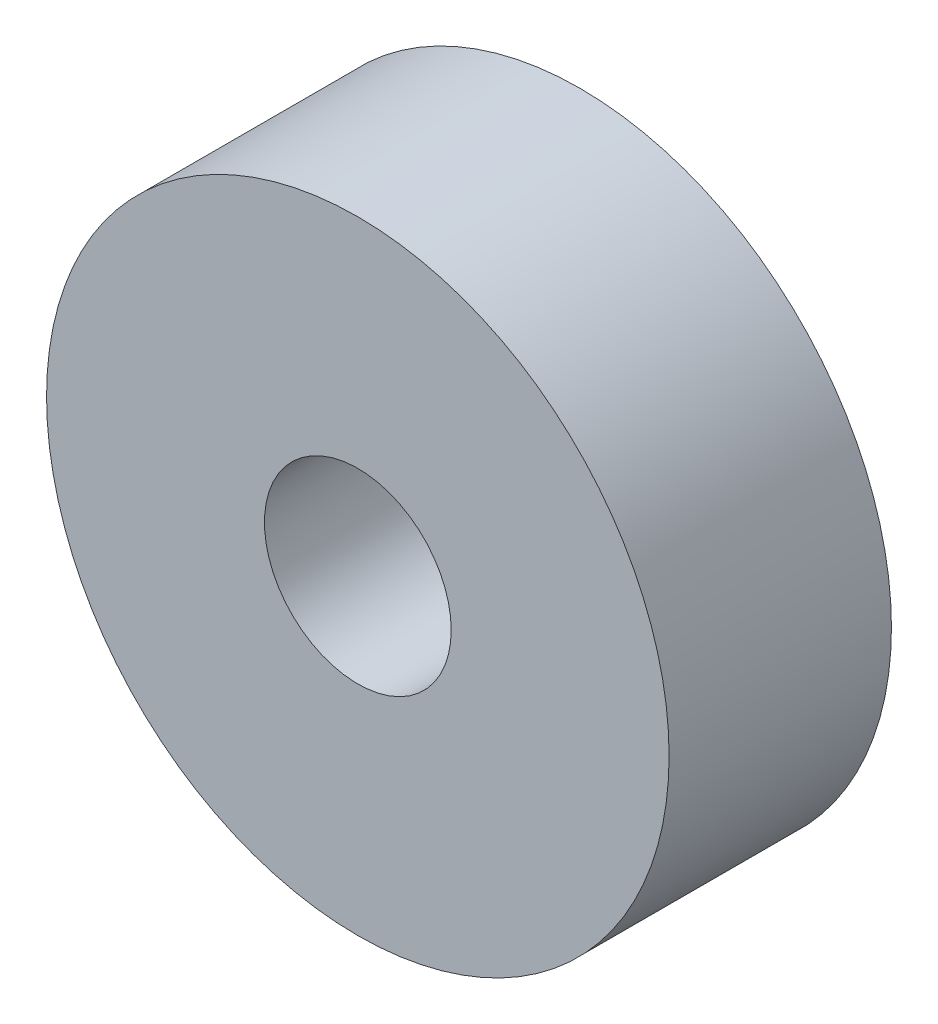
ISO-10303-21;
HEADER;
FILE_DESCRIPTION(('STEP AP214'),'2;1');
FILE_NAME('part.step','',(''),(''),'','','');
FILE_SCHEMA(('AUTOMOTIVE_DESIGN { 1 0 10303 214 1 1 1 1 }'));
ENDSEC;
DATA;
#1=APPLICATION_CONTEXT('core data for automotive mechanical design processes');
#2=APPLICATION_PROTOCOL_DEFINITION('international standard','automotive_design',2000,#1);
#3=PRODUCT_CONTEXT('',#1,'mechanical');
#4=PRODUCT('Part','Part','',(#3));
#5=PRODUCT_RELATED_PRODUCT_CATEGORY('part','',(#4));
#6=PRODUCT_DEFINITION_FORMATION('','',#4);
#7=PRODUCT_DEFINITION_CONTEXT('part definition',#1,'design');
#8=PRODUCT_DEFINITION('design','',#6,#7);
#9=PRODUCT_DEFINITION_SHAPE('','',#8);
#10=(LENGTH_UNIT() NAMED_UNIT(*) SI_UNIT(.MILLI.,.METRE.));
#11=(NAMED_UNIT(*) PLANE_ANGLE_UNIT() SI_UNIT($,.RADIAN.));
#12=(NAMED_UNIT(*) SI_UNIT($,.STERADIAN.) SOLID_ANGLE_UNIT());
#13=UNCERTAINTY_MEASURE_WITH_UNIT(LENGTH_MEASURE(1.E-05),#10,'distance_accuracy_value','');
#14=(GEOMETRIC_REPRESENTATION_CONTEXT(3) GLOBAL_UNCERTAINTY_ASSIGNED_CONTEXT((#13)) GLOBAL_UNIT_ASSIGNED_CONTEXT((#10,
#11,#12)) REPRESENTATION_CONTEXT('',''));
#15=CARTESIAN_POINT('',(0.,0.,0.));
#16=DIRECTION('',(0.,0.,1.));
#17=DIRECTION('',(1.,0.,0.));
#18=AXIS2_PLACEMENT_3D('',#15,#16,#17);
#19=CARTESIAN_POINT('',(0.,0.,5.));
#20=DIRECTION('',(0.,0.,1.));
#21=DIRECTION('',(1.,0.,0.));
#22=AXIS2_PLACEMENT_3D('',#19,#20,#21);
#23=PLANE('',#22);
#24=CARTESIAN_POINT('',(0.,0.,5.));
#25=DIRECTION('',(0.,0.,1.));
#26=DIRECTION('',(1.,0.,0.));
#27=AXIS2_PLACEMENT_3D('',#24,#25,#26);
#28=CIRCLE('',#27,7.);
#29=CARTESIAN_POINT('',(7.,0.,5.));
#30=VERTEX_POINT('',#29);
#31=EDGE_CURVE('E10',#30,#30,#28,.T.);
#32=ORIENTED_EDGE('',*,*,#31,.T.);
#33=EDGE_LOOP('',(#32));
#34=FACE_BOUND('',#33,.T.);
#35=CARTESIAN_POINT('',(0.,0.,5.));
#36=DIRECTION('',(0.,0.,1.));
#37=DIRECTION('',(1.,0.,0.));
#38=AXIS2_PLACEMENT_3D('',#35,#36,#37);
#39=CIRCLE('',#38,2.1);
#40=CARTESIAN_POINT('',(2.1,0.,5.));
#41=VERTEX_POINT('',#40);
#42=EDGE_CURVE('E56',#41,#41,#39,.T.);
#43=ORIENTED_EDGE('',*,*,#42,.F.);
#44=EDGE_LOOP('',(#43));
#45=FACE_BOUND('',#44,.T.);
#46=ADVANCED_FACE('F43',(#34,#45),#23,.T.);
#47=CARTESIAN_POINT('',(0.,0.,0.));
#48=DIRECTION('',(0.,0.,1.));
#49=DIRECTION('',(1.,0.,0.));
#50=AXIS2_PLACEMENT_3D('',#47,#48,#49);
#51=PLANE('',#50);
#52=CARTESIAN_POINT('',(0.,0.,0.));
#53=DIRECTION('',(0.,0.,1.));
#54=DIRECTION('',(1.,0.,0.));
#55=AXIS2_PLACEMENT_3D('',#52,#53,#54);
#56=CIRCLE('',#55,7.);
#57=CARTESIAN_POINT('',(7.,0.,0.));
#58=VERTEX_POINT('',#57);
#59=EDGE_CURVE('E47',#58,#58,#56,.T.);
#60=ORIENTED_EDGE('',*,*,#59,.F.);
#61=EDGE_LOOP('',(#60));
#62=FACE_BOUND('',#61,.T.);
#63=CARTESIAN_POINT('',(0.,0.,0.));
#64=DIRECTION('',(0.,0.,1.));
#65=DIRECTION('',(1.,0.,0.));
#66=AXIS2_PLACEMENT_3D('',#63,#64,#65);
#67=CIRCLE('',#66,2.1);
#68=CARTESIAN_POINT('',(2.1,0.,0.));
#69=VERTEX_POINT('',#68);
#70=EDGE_CURVE('E58',#69,#69,#67,.T.);
#71=ORIENTED_EDGE('',*,*,#70,.T.);
#72=EDGE_LOOP('',(#71));
#73=FACE_BOUND('',#72,.T.);
#74=ADVANCED_FACE('F70',(#62,#73),#51,.F.);
#75=CARTESIAN_POINT('',(0.,0.,5.));
#76=DIRECTION('',(0.,0.,-1.));
#77=DIRECTION('',(-1.,0.,0.));
#78=AXIS2_PLACEMENT_3D('',#75,#76,#77);
#79=CYLINDRICAL_SURFACE('',#78,7.);
#80=ORIENTED_EDGE('',*,*,#31,.F.);
#81=EDGE_LOOP('',(#80));
#82=FACE_BOUND('',#81,.T.);
#83=ORIENTED_EDGE('',*,*,#59,.T.);
#84=EDGE_LOOP('',(#83));
#85=FACE_BOUND('',#84,.T.);
#86=ADVANCED_FACE('F45',(#82,#85),#79,.T.);
#87=CARTESIAN_POINT('',(0.,0.,5.));
#88=DIRECTION('',(0.,0.,-1.));
#89=DIRECTION('',(-1.,0.,0.));
#90=AXIS2_PLACEMENT_3D('',#87,#88,#89);
#91=CYLINDRICAL_SURFACE('',#90,2.1);
#92=ORIENTED_EDGE('',*,*,#42,.T.);
#93=EDGE_LOOP('',(#92));
#94=FACE_BOUND('',#93,.T.);
#95=ORIENTED_EDGE('',*,*,#70,.F.);
#96=EDGE_LOOP('',(#95));
#97=FACE_BOUND('',#96,.T.);
#98=ADVANCED_FACE('F66',(#94,#97),#91,.F.);
#99=CLOSED_SHELL('',(#46,#74,#86,#98));
#100=MANIFOLD_SOLID_BREP('B2',#99);
#101=ADVANCED_BREP_SHAPE_REPRESENTATION('',(#18,#100),#14);
#102=SHAPE_DEFINITION_REPRESENTATION(#9,#101);
ENDSEC;
END-ISO-10303-21;
